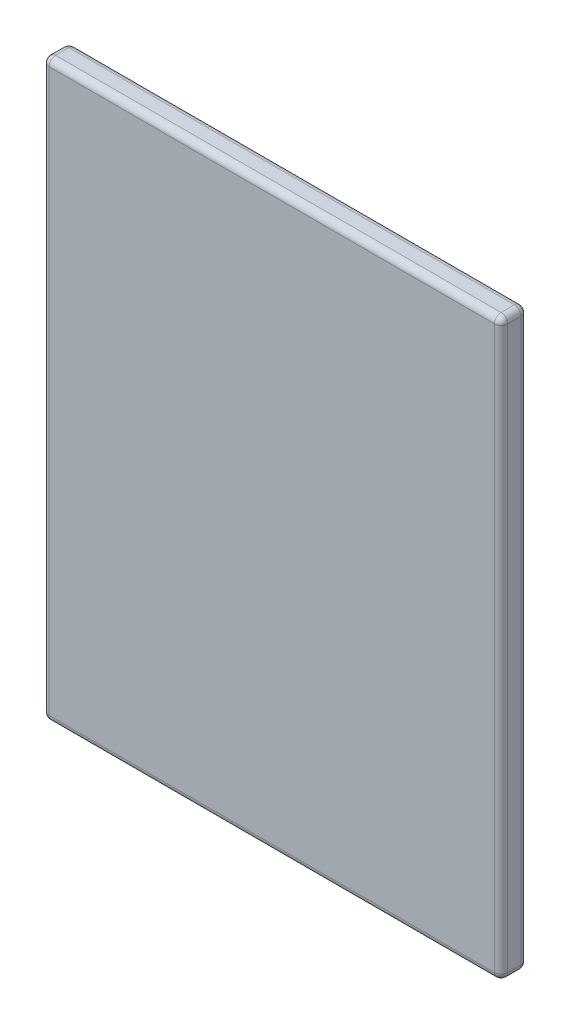
ISO-10303-21;
HEADER;
FILE_DESCRIPTION(('STEP AP214'),'2;1');
FILE_NAME('part.step','',(''),(''),'','','');
FILE_SCHEMA(('AUTOMOTIVE_DESIGN { 1 0 10303 214 1 1 1 1 }'));
ENDSEC;
DATA;
#1=APPLICATION_CONTEXT('core data for automotive mechanical design processes');
#2=APPLICATION_PROTOCOL_DEFINITION('international standard','automotive_design',2000,#1);
#3=PRODUCT_CONTEXT('',#1,'mechanical');
#4=PRODUCT('Part','Part','',(#3));
#5=PRODUCT_RELATED_PRODUCT_CATEGORY('part','',(#4));
#6=PRODUCT_DEFINITION_FORMATION('','',#4);
#7=PRODUCT_DEFINITION_CONTEXT('part definition',#1,'design');
#8=PRODUCT_DEFINITION('design','',#6,#7);
#9=PRODUCT_DEFINITION_SHAPE('','',#8);
#10=(LENGTH_UNIT() NAMED_UNIT(*) SI_UNIT(.MILLI.,.METRE.));
#11=(NAMED_UNIT(*) PLANE_ANGLE_UNIT() SI_UNIT($,.RADIAN.));
#12=(NAMED_UNIT(*) SI_UNIT($,.STERADIAN.) SOLID_ANGLE_UNIT());
#13=UNCERTAINTY_MEASURE_WITH_UNIT(LENGTH_MEASURE(1.E-05),#10,'distance_accuracy_value','');
#14=(GEOMETRIC_REPRESENTATION_CONTEXT(3) GLOBAL_UNCERTAINTY_ASSIGNED_CONTEXT((#13)) GLOBAL_UNIT_ASSIGNED_CONTEXT((#10,
#11,#12)) REPRESENTATION_CONTEXT('',''));
#15=CARTESIAN_POINT('',(0.,0.,0.));
#16=DIRECTION('',(0.,0.,1.));
#17=DIRECTION('',(1.,0.,0.));
#18=AXIS2_PLACEMENT_3D('',#15,#16,#17);
#19=CARTESIAN_POINT('',(17.35,-21.75,2.));
#20=DIRECTION('',(-1.,0.,0.));
#21=DIRECTION('',(0.,0.,1.));
#22=AXIS2_PLACEMENT_3D('',#19,#20,#21);
#23=PLANE('',#22);
#24=DIRECTION('',(0.,1.,0.));
#25=VECTOR('',#24,1.);
#26=CARTESIAN_POINT('',(17.35,-21.75,1.5));
#27=LINE('',#26,#25);
#28=CARTESIAN_POINT('',(17.35,21.25,1.5));
#29=VERTEX_POINT('',#28);
#30=CARTESIAN_POINT('',(17.35,-21.25,1.5));
#31=VERTEX_POINT('',#30);
#32=EDGE_CURVE('E41',#29,#31,#27,.F.);
#33=ORIENTED_EDGE('',*,*,#32,.T.);
#34=DIRECTION('',(0.,0.,-1.));
#35=VECTOR('',#34,1.);
#36=CARTESIAN_POINT('',(17.35,-21.25,2.));
#37=LINE('',#36,#35);
#38=CARTESIAN_POINT('',(17.35,-21.25,0.5));
#39=VERTEX_POINT('',#38);
#40=EDGE_CURVE('E11',#31,#39,#37,.T.);
#41=ORIENTED_EDGE('',*,*,#40,.T.);
#42=DIRECTION('',(0.,1.,0.));
#43=VECTOR('',#42,1.);
#44=CARTESIAN_POINT('',(17.35,21.75,0.5));
#45=LINE('',#44,#43);
#46=CARTESIAN_POINT('',(17.35,21.25,0.5));
#47=VERTEX_POINT('',#46);
#48=EDGE_CURVE('E193',#39,#47,#45,.T.);
#49=ORIENTED_EDGE('',*,*,#48,.T.);
#50=DIRECTION('',(0.,0.,-1.));
#51=VECTOR('',#50,1.);
#52=CARTESIAN_POINT('',(17.35,21.25,2.));
#53=LINE('',#52,#51);
#54=EDGE_CURVE('E52',#47,#29,#53,.F.);
#55=ORIENTED_EDGE('',*,*,#54,.T.);
#56=EDGE_LOOP('',(#33,#41,#49,#55));
#57=FACE_BOUND('',#56,.T.);
#58=ADVANCED_FACE('F32',(#57),#23,.F.);
#59=CARTESIAN_POINT('',(-17.35,21.75,2.));
#60=DIRECTION('',(0.,-1.,0.));
#61=DIRECTION('',(0.,0.,-1.));
#62=AXIS2_PLACEMENT_3D('',#59,#60,#61);
#63=PLANE('',#62);
#64=DIRECTION('',(0.,0.,-1.));
#65=VECTOR('',#64,1.);
#66=CARTESIAN_POINT('',(-16.85,21.75,2.));
#67=LINE('',#66,#65);
#68=CARTESIAN_POINT('',(-16.85,21.75,0.5));
#69=VERTEX_POINT('',#68);
#70=CARTESIAN_POINT('',(-16.85,21.75,1.5));
#71=VERTEX_POINT('',#70);
#72=EDGE_CURVE('E188',#69,#71,#67,.F.);
#73=ORIENTED_EDGE('',*,*,#72,.T.);
#74=DIRECTION('',(-1.,0.,0.));
#75=VECTOR('',#74,1.);
#76=CARTESIAN_POINT('',(-17.35,21.75,1.5));
#77=LINE('',#76,#75);
#78=CARTESIAN_POINT('',(16.85,21.75,1.5));
#79=VERTEX_POINT('',#78);
#80=EDGE_CURVE('E190',#71,#79,#77,.F.);
#81=ORIENTED_EDGE('',*,*,#80,.T.);
#82=DIRECTION('',(0.,0.,-1.));
#83=VECTOR('',#82,1.);
#84=CARTESIAN_POINT('',(16.85,21.75,2.));
#85=LINE('',#84,#83);
#86=CARTESIAN_POINT('',(16.85,21.75,0.5));
#87=VERTEX_POINT('',#86);
#88=EDGE_CURVE('E184',#79,#87,#85,.T.);
#89=ORIENTED_EDGE('',*,*,#88,.T.);
#90=DIRECTION('',(-1.,0.,0.));
#91=VECTOR('',#90,1.);
#92=CARTESIAN_POINT('',(-17.35,21.75,0.5));
#93=LINE('',#92,#91);
#94=EDGE_CURVE('E186',#87,#69,#93,.T.);
#95=ORIENTED_EDGE('',*,*,#94,.T.);
#96=EDGE_LOOP('',(#73,#81,#89,#95));
#97=FACE_BOUND('',#96,.T.);
#98=ADVANCED_FACE('F277',(#97),#63,.F.);
#99=CARTESIAN_POINT('',(-17.35,-21.75,2.));
#100=DIRECTION('',(1.,0.,0.));
#101=DIRECTION('',(0.,0.,-1.));
#102=AXIS2_PLACEMENT_3D('',#99,#100,#101);
#103=PLANE('',#102);
#104=DIRECTION('',(0.,0.,-1.));
#105=VECTOR('',#104,1.);
#106=CARTESIAN_POINT('',(-17.35,-21.25,2.));
#107=LINE('',#106,#105);
#108=CARTESIAN_POINT('',(-17.35,-21.25,0.5));
#109=VERTEX_POINT('',#108);
#110=CARTESIAN_POINT('',(-17.35,-21.25,1.5));
#111=VERTEX_POINT('',#110);
#112=EDGE_CURVE('E179',#109,#111,#107,.F.);
#113=ORIENTED_EDGE('',*,*,#112,.T.);
#114=DIRECTION('',(0.,-1.,0.));
#115=VECTOR('',#114,1.);
#116=CARTESIAN_POINT('',(-17.35,-21.75,1.5));
#117=LINE('',#116,#115);
#118=CARTESIAN_POINT('',(-17.35,21.25,1.5));
#119=VERTEX_POINT('',#118);
#120=EDGE_CURVE('E181',#111,#119,#117,.F.);
#121=ORIENTED_EDGE('',*,*,#120,.T.);
#122=DIRECTION('',(0.,0.,-1.));
#123=VECTOR('',#122,1.);
#124=CARTESIAN_POINT('',(-17.35,21.25,2.));
#125=LINE('',#124,#123);
#126=CARTESIAN_POINT('',(-17.35,21.25,0.5));
#127=VERTEX_POINT('',#126);
#128=EDGE_CURVE('E175',#119,#127,#125,.T.);
#129=ORIENTED_EDGE('',*,*,#128,.T.);
#130=DIRECTION('',(0.,-1.,0.));
#131=VECTOR('',#130,1.);
#132=CARTESIAN_POINT('',(-17.35,-21.75,0.5));
#133=LINE('',#132,#131);
#134=EDGE_CURVE('E177',#127,#109,#133,.T.);
#135=ORIENTED_EDGE('',*,*,#134,.T.);
#136=EDGE_LOOP('',(#113,#121,#129,#135));
#137=FACE_BOUND('',#136,.T.);
#138=ADVANCED_FACE('F268',(#137),#103,.F.);
#139=CARTESIAN_POINT('',(-17.35,-21.75,2.));
#140=DIRECTION('',(0.,1.,0.));
#141=DIRECTION('',(0.,0.,1.));
#142=AXIS2_PLACEMENT_3D('',#139,#140,#141);
#143=PLANE('',#142);
#144=DIRECTION('',(1.,0.,0.));
#145=VECTOR('',#144,1.);
#146=CARTESIAN_POINT('',(-17.35,-21.75,1.5));
#147=LINE('',#146,#145);
#148=CARTESIAN_POINT('',(16.85,-21.75,1.5));
#149=VERTEX_POINT('',#148);
#150=CARTESIAN_POINT('',(-16.85,-21.75,1.5));
#151=VERTEX_POINT('',#150);
#152=EDGE_CURVE('E128',#149,#151,#147,.F.);
#153=ORIENTED_EDGE('',*,*,#152,.T.);
#154=DIRECTION('',(0.,0.,-1.));
#155=VECTOR('',#154,1.);
#156=CARTESIAN_POINT('',(-16.85,-21.75,2.));
#157=LINE('',#156,#155);
#158=CARTESIAN_POINT('',(-16.85,-21.75,0.5));
#159=VERTEX_POINT('',#158);
#160=EDGE_CURVE('E164',#151,#159,#157,.T.);
#161=ORIENTED_EDGE('',*,*,#160,.T.);
#162=DIRECTION('',(1.,0.,0.));
#163=VECTOR('',#162,1.);
#164=CARTESIAN_POINT('',(17.35,-21.75,0.5));
#165=LINE('',#164,#163);
#166=CARTESIAN_POINT('',(16.85,-21.75,0.5));
#167=VERTEX_POINT('',#166);
#168=EDGE_CURVE('E157',#159,#167,#165,.T.);
#169=ORIENTED_EDGE('',*,*,#168,.T.);
#170=DIRECTION('',(0.,0.,-1.));
#171=VECTOR('',#170,1.);
#172=CARTESIAN_POINT('',(16.85,-21.75,2.));
#173=LINE('',#172,#171);
#174=EDGE_CURVE('E155',#167,#149,#173,.F.);
#175=ORIENTED_EDGE('',*,*,#174,.T.);
#176=EDGE_LOOP('',(#153,#161,#169,#175));
#177=FACE_BOUND('',#176,.T.);
#178=ADVANCED_FACE('F355',(#177),#143,.F.);
#179=CARTESIAN_POINT('',(0.,0.,2.));
#180=DIRECTION('',(0.,0.,-1.));
#181=DIRECTION('',(-1.,0.,0.));
#182=AXIS2_PLACEMENT_3D('',#179,#180,#181);
#183=PLANE('',#182);
#184=DIRECTION('',(0.,-1.,0.));
#185=VECTOR('',#184,1.);
#186=CARTESIAN_POINT('',(-16.85,0.,2.));
#187=LINE('',#186,#185);
#188=CARTESIAN_POINT('',(-16.85,21.25,2.));
#189=VERTEX_POINT('',#188);
#190=CARTESIAN_POINT('',(-16.85,-21.25,2.));
#191=VERTEX_POINT('',#190);
#192=EDGE_CURVE('E153',#189,#191,#187,.T.);
#193=ORIENTED_EDGE('',*,*,#192,.T.);
#194=DIRECTION('',(1.,0.,0.));
#195=VECTOR('',#194,1.);
#196=CARTESIAN_POINT('',(0.,-21.25,2.));
#197=LINE('',#196,#195);
#198=CARTESIAN_POINT('',(16.85,-21.25,2.));
#199=VERTEX_POINT('',#198);
#200=EDGE_CURVE('E126',#191,#199,#197,.T.);
#201=ORIENTED_EDGE('',*,*,#200,.T.);
#202=DIRECTION('',(0.,1.,0.));
#203=VECTOR('',#202,1.);
#204=CARTESIAN_POINT('',(16.85,0.,2.));
#205=LINE('',#204,#203);
#206=CARTESIAN_POINT('',(16.85,21.25,2.));
#207=VERTEX_POINT('',#206);
#208=EDGE_CURVE('E143',#199,#207,#205,.T.);
#209=ORIENTED_EDGE('',*,*,#208,.T.);
#210=DIRECTION('',(-1.,0.,0.));
#211=VECTOR('',#210,1.);
#212=CARTESIAN_POINT('',(0.,21.25,2.));
#213=LINE('',#212,#211);
#214=EDGE_CURVE('E149',#207,#189,#213,.T.);
#215=ORIENTED_EDGE('',*,*,#214,.T.);
#216=EDGE_LOOP('',(#193,#201,#209,#215));
#217=FACE_BOUND('',#216,.T.);
#218=ADVANCED_FACE('F151',(#217),#183,.F.);
#219=CARTESIAN_POINT('',(0.,0.,0.));
#220=DIRECTION('',(0.,0.,-1.));
#221=DIRECTION('',(-1.,0.,0.));
#222=AXIS2_PLACEMENT_3D('',#219,#220,#221);
#223=PLANE('',#222);
#224=DIRECTION('',(0.,1.,0.));
#225=VECTOR('',#224,1.);
#226=CARTESIAN_POINT('',(16.85,-21.75,0.));
#227=LINE('',#226,#225);
#228=CARTESIAN_POINT('',(16.85,21.25,0.));
#229=VERTEX_POINT('',#228);
#230=CARTESIAN_POINT('',(16.85,-21.25,0.));
#231=VERTEX_POINT('',#230);
#232=EDGE_CURVE('E166',#229,#231,#227,.F.);
#233=ORIENTED_EDGE('',*,*,#232,.T.);
#234=DIRECTION('',(1.,0.,0.));
#235=VECTOR('',#234,1.);
#236=CARTESIAN_POINT('',(-17.35,-21.25,0.));
#237=LINE('',#236,#235);
#238=CARTESIAN_POINT('',(-16.85,-21.25,0.));
#239=VERTEX_POINT('',#238);
#240=EDGE_CURVE('E172',#231,#239,#237,.F.);
#241=ORIENTED_EDGE('',*,*,#240,.T.);
#242=DIRECTION('',(0.,-1.,0.));
#243=VECTOR('',#242,1.);
#244=CARTESIAN_POINT('',(-16.85,21.75,0.));
#245=LINE('',#244,#243);
#246=CARTESIAN_POINT('',(-16.85,21.25,0.));
#247=VERTEX_POINT('',#246);
#248=EDGE_CURVE('E170',#239,#247,#245,.F.);
#249=ORIENTED_EDGE('',*,*,#248,.T.);
#250=DIRECTION('',(-1.,0.,0.));
#251=VECTOR('',#250,1.);
#252=CARTESIAN_POINT('',(17.35,21.25,0.));
#253=LINE('',#252,#251);
#254=EDGE_CURVE('E168',#247,#229,#253,.F.);
#255=ORIENTED_EDGE('',*,*,#254,.T.);
#256=EDGE_LOOP('',(#233,#241,#249,#255));
#257=FACE_BOUND('',#256,.T.);
#258=ADVANCED_FACE('F295',(#257),#223,.T.);
#259=CARTESIAN_POINT('',(-17.35,21.25,0.5));
#260=DIRECTION('',(1.,0.,0.));
#261=DIRECTION('',(0.,0.,-1.));
#262=AXIS2_PLACEMENT_3D('',#259,#260,#261);
#263=CYLINDRICAL_SURFACE('',#262,0.5);
#264=CARTESIAN_POINT('',(-16.85,21.25,0.5));
#265=DIRECTION('',(-1.,0.,0.));
#266=DIRECTION('',(0.,0.,1.));
#267=AXIS2_PLACEMENT_3D('',#264,#265,#266);
#268=CIRCLE('',#267,0.5);
#269=EDGE_CURVE('E36',#69,#247,#268,.T.);
#270=ORIENTED_EDGE('',*,*,#269,.F.);
#271=ORIENTED_EDGE('',*,*,#94,.F.);
#272=CARTESIAN_POINT('',(16.85,21.25,0.5));
#273=DIRECTION('',(1.,0.,0.));
#274=DIRECTION('',(0.,0.,-1.));
#275=AXIS2_PLACEMENT_3D('',#272,#273,#274);
#276=CIRCLE('',#275,0.5);
#277=EDGE_CURVE('E245',#229,#87,#276,.T.);
#278=ORIENTED_EDGE('',*,*,#277,.F.);
#279=ORIENTED_EDGE('',*,*,#254,.F.);
#280=EDGE_LOOP('',(#270,#271,#278,#279));
#281=FACE_BOUND('',#280,.T.);
#282=ADVANCED_FACE('F34',(#281),#263,.T.);
#283=CARTESIAN_POINT('',(-16.85,21.25,0.5));
#284=DIRECTION('',(0.,0.,1.));
#285=DIRECTION('',(1.,0.,0.));
#286=AXIS2_PLACEMENT_3D('',#283,#284,#285);
#287=SPHERICAL_SURFACE('',#286,0.5);
#288=CARTESIAN_POINT('',(-16.85,21.25,0.5));
#289=DIRECTION('',(0.,0.,-1.));
#290=DIRECTION('',(-1.,0.,0.));
#291=AXIS2_PLACEMENT_3D('',#288,#289,#290);
#292=CIRCLE('',#291,0.5);
#293=EDGE_CURVE('E240',#69,#127,#292,.F.);
#294=ORIENTED_EDGE('',*,*,#293,.F.);
#295=ORIENTED_EDGE('',*,*,#269,.T.);
#296=CARTESIAN_POINT('',(-16.85,21.25,0.5));
#297=DIRECTION('',(0.,1.,0.));
#298=DIRECTION('',(0.,0.,1.));
#299=AXIS2_PLACEMENT_3D('',#296,#297,#298);
#300=CIRCLE('',#299,0.5);
#301=EDGE_CURVE('E243',#127,#247,#300,.F.);
#302=ORIENTED_EDGE('',*,*,#301,.F.);
#303=EDGE_LOOP('',(#294,#295,#302));
#304=FACE_BOUND('',#303,.T.);
#305=ADVANCED_FACE('F256',(#304),#287,.T.);
#306=CARTESIAN_POINT('',(16.85,21.25,0.5));
#307=DIRECTION('',(0.,0.,1.));
#308=DIRECTION('',(1.,0.,0.));
#309=AXIS2_PLACEMENT_3D('',#306,#307,#308);
#310=SPHERICAL_SURFACE('',#309,0.5);
#311=CARTESIAN_POINT('',(16.85,21.25,0.5));
#312=DIRECTION('',(0.,1.,0.));
#313=DIRECTION('',(0.,0.,1.));
#314=AXIS2_PLACEMENT_3D('',#311,#312,#313);
#315=CIRCLE('',#314,0.5);
#316=EDGE_CURVE('E234',#229,#47,#315,.F.);
#317=ORIENTED_EDGE('',*,*,#316,.F.);
#318=ORIENTED_EDGE('',*,*,#277,.T.);
#319=CARTESIAN_POINT('',(16.85,21.25,0.5));
#320=DIRECTION('',(0.,0.,-1.));
#321=DIRECTION('',(-1.,0.,0.));
#322=AXIS2_PLACEMENT_3D('',#319,#320,#321);
#323=CIRCLE('',#322,0.5);
#324=EDGE_CURVE('E237',#47,#87,#323,.F.);
#325=ORIENTED_EDGE('',*,*,#324,.F.);
#326=EDGE_LOOP('',(#317,#318,#325));
#327=FACE_BOUND('',#326,.T.);
#328=ADVANCED_FACE('F288',(#327),#310,.T.);
#329=CARTESIAN_POINT('',(-16.85,-21.75,0.5));
#330=DIRECTION('',(0.,1.,0.));
#331=DIRECTION('',(0.,0.,1.));
#332=AXIS2_PLACEMENT_3D('',#329,#330,#331);
#333=CYLINDRICAL_SURFACE('',#332,0.5);
#334=ORIENTED_EDGE('',*,*,#301,.T.);
#335=ORIENTED_EDGE('',*,*,#248,.F.);
#336=CARTESIAN_POINT('',(-16.85,-21.25,0.5));
#337=DIRECTION('',(0.,-1.,0.));
#338=DIRECTION('',(0.,0.,-1.));
#339=AXIS2_PLACEMENT_3D('',#336,#337,#338);
#340=CIRCLE('',#339,0.5);
#341=EDGE_CURVE('E229',#109,#239,#340,.T.);
#342=ORIENTED_EDGE('',*,*,#341,.F.);
#343=ORIENTED_EDGE('',*,*,#134,.F.);
#344=EDGE_LOOP('',(#334,#335,#342,#343));
#345=FACE_BOUND('',#344,.T.);
#346=ADVANCED_FACE('F264',(#345),#333,.T.);
#347=CARTESIAN_POINT('',(-16.85,21.25,2.));
#348=DIRECTION('',(0.,0.,-1.));
#349=DIRECTION('',(-1.,0.,0.));
#350=AXIS2_PLACEMENT_3D('',#347,#348,#349);
#351=CYLINDRICAL_SURFACE('',#350,0.5);
#352=ORIENTED_EDGE('',*,*,#293,.T.);
#353=ORIENTED_EDGE('',*,*,#128,.F.);
#354=CARTESIAN_POINT('',(-16.85,21.25,1.5));
#355=DIRECTION('',(0.,0.,1.));
#356=DIRECTION('',(1.,0.,0.));
#357=AXIS2_PLACEMENT_3D('',#354,#355,#356);
#358=CIRCLE('',#357,0.5);
#359=EDGE_CURVE('E226',#71,#119,#358,.T.);
#360=ORIENTED_EDGE('',*,*,#359,.F.);
#361=ORIENTED_EDGE('',*,*,#72,.F.);
#362=EDGE_LOOP('',(#352,#353,#360,#361));
#363=FACE_BOUND('',#362,.T.);
#364=ADVANCED_FACE('F274',(#363),#351,.T.);
#365=CARTESIAN_POINT('',(0.,21.25,1.5));
#366=DIRECTION('',(-1.,0.,0.));
#367=DIRECTION('',(0.,0.,1.));
#368=AXIS2_PLACEMENT_3D('',#365,#366,#367);
#369=CYLINDRICAL_SURFACE('',#368,0.5);
#370=CARTESIAN_POINT('',(16.85,21.25,1.5));
#371=DIRECTION('',(1.,0.,0.));
#372=DIRECTION('',(0.,0.,-1.));
#373=AXIS2_PLACEMENT_3D('',#370,#371,#372);
#374=CIRCLE('',#373,0.5);
#375=EDGE_CURVE('E220',#79,#207,#374,.T.);
#376=ORIENTED_EDGE('',*,*,#375,.F.);
#377=ORIENTED_EDGE('',*,*,#80,.F.);
#378=CARTESIAN_POINT('',(-16.85,21.25,1.5));
#379=DIRECTION('',(-1.,0.,0.));
#380=DIRECTION('',(0.,0.,1.));
#381=AXIS2_PLACEMENT_3D('',#378,#379,#380);
#382=CIRCLE('',#381,0.5);
#383=EDGE_CURVE('E223',#189,#71,#382,.T.);
#384=ORIENTED_EDGE('',*,*,#383,.F.);
#385=ORIENTED_EDGE('',*,*,#214,.F.);
#386=EDGE_LOOP('',(#376,#377,#384,#385));
#387=FACE_BOUND('',#386,.T.);
#388=ADVANCED_FACE('F281',(#387),#369,.T.);
#389=CARTESIAN_POINT('',(16.85,21.25,2.));
#390=DIRECTION('',(0.,0.,-1.));
#391=DIRECTION('',(-1.,0.,0.));
#392=AXIS2_PLACEMENT_3D('',#389,#390,#391);
#393=CYLINDRICAL_SURFACE('',#392,0.5);
#394=ORIENTED_EDGE('',*,*,#324,.T.);
#395=ORIENTED_EDGE('',*,*,#88,.F.);
#396=CARTESIAN_POINT('',(16.85,21.25,1.5));
#397=DIRECTION('',(0.,0.,1.));
#398=DIRECTION('',(1.,0.,0.));
#399=AXIS2_PLACEMENT_3D('',#396,#397,#398);
#400=CIRCLE('',#399,0.5);
#401=EDGE_CURVE('E218',#29,#79,#400,.T.);
#402=ORIENTED_EDGE('',*,*,#401,.F.);
#403=ORIENTED_EDGE('',*,*,#54,.F.);
#404=EDGE_LOOP('',(#394,#395,#402,#403));
#405=FACE_BOUND('',#404,.T.);
#406=ADVANCED_FACE('F286',(#405),#393,.T.);
#407=CARTESIAN_POINT('',(16.85,-21.75,0.5));
#408=DIRECTION('',(0.,-1.,0.));
#409=DIRECTION('',(0.,0.,-1.));
#410=AXIS2_PLACEMENT_3D('',#407,#408,#409);
#411=CYLINDRICAL_SURFACE('',#410,0.5);
#412=ORIENTED_EDGE('',*,*,#316,.T.);
#413=ORIENTED_EDGE('',*,*,#48,.F.);
#414=CARTESIAN_POINT('',(16.85,-21.25,0.5));
#415=DIRECTION('',(0.,-1.,0.));
#416=DIRECTION('',(0.,0.,-1.));
#417=AXIS2_PLACEMENT_3D('',#414,#415,#416);
#418=CIRCLE('',#417,0.5);
#419=EDGE_CURVE('E215',#231,#39,#418,.T.);
#420=ORIENTED_EDGE('',*,*,#419,.F.);
#421=ORIENTED_EDGE('',*,*,#232,.F.);
#422=EDGE_LOOP('',(#412,#413,#420,#421));
#423=FACE_BOUND('',#422,.T.);
#424=ADVANCED_FACE('F292',(#423),#411,.T.);
#425=CARTESIAN_POINT('',(-17.35,-21.25,0.5));
#426=DIRECTION('',(-1.,0.,0.));
#427=DIRECTION('',(0.,0.,1.));
#428=AXIS2_PLACEMENT_3D('',#425,#426,#427);
#429=CYLINDRICAL_SURFACE('',#428,0.5);
#430=CARTESIAN_POINT('',(-16.85,-21.25,0.5));
#431=DIRECTION('',(-1.,0.,0.));
#432=DIRECTION('',(0.,0.,1.));
#433=AXIS2_PLACEMENT_3D('',#430,#431,#432);
#434=CIRCLE('',#433,0.5);
#435=EDGE_CURVE('E231',#239,#159,#434,.T.);
#436=ORIENTED_EDGE('',*,*,#435,.F.);
#437=ORIENTED_EDGE('',*,*,#240,.F.);
#438=CARTESIAN_POINT('',(16.85,-21.25,0.5));
#439=DIRECTION('',(1.,0.,0.));
#440=DIRECTION('',(0.,0.,-1.));
#441=AXIS2_PLACEMENT_3D('',#438,#439,#440);
#442=CIRCLE('',#441,0.5);
#443=EDGE_CURVE('E212',#167,#231,#442,.T.);
#444=ORIENTED_EDGE('',*,*,#443,.F.);
#445=ORIENTED_EDGE('',*,*,#168,.F.);
#446=EDGE_LOOP('',(#436,#437,#444,#445));
#447=FACE_BOUND('',#446,.T.);
#448=ADVANCED_FACE('F299',(#447),#429,.T.);
#449=CARTESIAN_POINT('',(-16.85,-21.25,0.5));
#450=DIRECTION('',(0.,0.,1.));
#451=DIRECTION('',(1.,0.,0.));
#452=AXIS2_PLACEMENT_3D('',#449,#450,#451);
#453=SPHERICAL_SURFACE('',#452,0.5);
#454=ORIENTED_EDGE('',*,*,#341,.T.);
#455=ORIENTED_EDGE('',*,*,#435,.T.);
#456=CARTESIAN_POINT('',(-16.85,-21.25,0.5));
#457=DIRECTION('',(0.,0.,-1.));
#458=DIRECTION('',(-1.,0.,0.));
#459=AXIS2_PLACEMENT_3D('',#456,#457,#458);
#460=CIRCLE('',#459,0.5);
#461=EDGE_CURVE('E209',#109,#159,#460,.F.);
#462=ORIENTED_EDGE('',*,*,#461,.F.);
#463=EDGE_LOOP('',(#454,#455,#462));
#464=FACE_BOUND('',#463,.T.);
#465=ADVANCED_FACE('F303',(#464),#453,.T.);
#466=CARTESIAN_POINT('',(-16.85,21.25,1.5));
#467=DIRECTION('',(0.,0.,1.));
#468=DIRECTION('',(1.,0.,0.));
#469=AXIS2_PLACEMENT_3D('',#466,#467,#468);
#470=SPHERICAL_SURFACE('',#469,0.5);
#471=ORIENTED_EDGE('',*,*,#383,.T.);
#472=ORIENTED_EDGE('',*,*,#359,.T.);
#473=CARTESIAN_POINT('',(-16.85,21.25,1.5));
#474=DIRECTION('',(0.,1.,0.));
#475=DIRECTION('',(0.,0.,1.));
#476=AXIS2_PLACEMENT_3D('',#473,#474,#475);
#477=CIRCLE('',#476,0.5);
#478=EDGE_CURVE('E207',#189,#119,#477,.F.);
#479=ORIENTED_EDGE('',*,*,#478,.F.);
#480=EDGE_LOOP('',(#471,#472,#479));
#481=FACE_BOUND('',#480,.T.);
#482=ADVANCED_FACE('F314',(#481),#470,.T.);
#483=CARTESIAN_POINT('',(16.85,21.25,1.5));
#484=DIRECTION('',(0.,0.,1.));
#485=DIRECTION('',(1.,0.,0.));
#486=AXIS2_PLACEMENT_3D('',#483,#484,#485);
#487=SPHERICAL_SURFACE('',#486,0.5);
#488=ORIENTED_EDGE('',*,*,#401,.T.);
#489=ORIENTED_EDGE('',*,*,#375,.T.);
#490=CARTESIAN_POINT('',(16.85,21.25,1.5));
#491=DIRECTION('',(0.,1.,0.));
#492=DIRECTION('',(0.,0.,1.));
#493=AXIS2_PLACEMENT_3D('',#490,#491,#492);
#494=CIRCLE('',#493,0.5);
#495=EDGE_CURVE('E146',#29,#207,#494,.F.);
#496=ORIENTED_EDGE('',*,*,#495,.F.);
#497=EDGE_LOOP('',(#488,#489,#496));
#498=FACE_BOUND('',#497,.T.);
#499=ADVANCED_FACE('F316',(#498),#487,.T.);
#500=CARTESIAN_POINT('',(16.85,-21.25,0.5));
#501=DIRECTION('',(0.,0.,1.));
#502=DIRECTION('',(1.,0.,0.));
#503=AXIS2_PLACEMENT_3D('',#500,#501,#502);
#504=SPHERICAL_SURFACE('',#503,0.5);
#505=ORIENTED_EDGE('',*,*,#443,.T.);
#506=ORIENTED_EDGE('',*,*,#419,.T.);
#507=CARTESIAN_POINT('',(16.85,-21.25,0.5));
#508=DIRECTION('',(0.,0.,-1.));
#509=DIRECTION('',(-1.,0.,0.));
#510=AXIS2_PLACEMENT_3D('',#507,#508,#509);
#511=CIRCLE('',#510,0.5);
#512=EDGE_CURVE('E204',#167,#39,#511,.F.);
#513=ORIENTED_EDGE('',*,*,#512,.F.);
#514=EDGE_LOOP('',(#505,#506,#513));
#515=FACE_BOUND('',#514,.T.);
#516=ADVANCED_FACE('F322',(#515),#504,.T.);
#517=CARTESIAN_POINT('',(-16.85,-21.25,2.));
#518=DIRECTION('',(0.,0.,-1.));
#519=DIRECTION('',(-1.,0.,0.));
#520=AXIS2_PLACEMENT_3D('',#517,#518,#519);
#521=CYLINDRICAL_SURFACE('',#520,0.5);
#522=ORIENTED_EDGE('',*,*,#461,.T.);
#523=ORIENTED_EDGE('',*,*,#160,.F.);
#524=CARTESIAN_POINT('',(-16.85,-21.25,1.5));
#525=DIRECTION('',(0.,0.,1.));
#526=DIRECTION('',(1.,0.,0.));
#527=AXIS2_PLACEMENT_3D('',#524,#525,#526);
#528=CIRCLE('',#527,0.5);
#529=EDGE_CURVE('E201',#111,#151,#528,.T.);
#530=ORIENTED_EDGE('',*,*,#529,.F.);
#531=ORIENTED_EDGE('',*,*,#112,.F.);
#532=EDGE_LOOP('',(#522,#523,#530,#531));
#533=FACE_BOUND('',#532,.T.);
#534=ADVANCED_FACE('F306',(#533),#521,.T.);
#535=CARTESIAN_POINT('',(-16.85,0.,1.5));
#536=DIRECTION('',(0.,-1.,0.));
#537=DIRECTION('',(0.,0.,-1.));
#538=AXIS2_PLACEMENT_3D('',#535,#536,#537);
#539=CYLINDRICAL_SURFACE('',#538,0.5);
#540=ORIENTED_EDGE('',*,*,#478,.T.);
#541=ORIENTED_EDGE('',*,*,#120,.F.);
#542=CARTESIAN_POINT('',(-16.85,-21.25,1.5));
#543=DIRECTION('',(0.,-1.,0.));
#544=DIRECTION('',(0.,0.,-1.));
#545=AXIS2_PLACEMENT_3D('',#542,#543,#544);
#546=CIRCLE('',#545,0.5);
#547=EDGE_CURVE('E140',#191,#111,#546,.T.);
#548=ORIENTED_EDGE('',*,*,#547,.F.);
#549=ORIENTED_EDGE('',*,*,#192,.F.);
#550=EDGE_LOOP('',(#540,#541,#548,#549));
#551=FACE_BOUND('',#550,.T.);
#552=ADVANCED_FACE('F312',(#551),#539,.T.);
#553=CARTESIAN_POINT('',(16.85,0.,1.5));
#554=DIRECTION('',(0.,1.,0.));
#555=DIRECTION('',(0.,0.,1.));
#556=AXIS2_PLACEMENT_3D('',#553,#554,#555);
#557=CYLINDRICAL_SURFACE('',#556,0.5);
#558=ORIENTED_EDGE('',*,*,#495,.T.);
#559=ORIENTED_EDGE('',*,*,#208,.F.);
#560=CARTESIAN_POINT('',(16.85,-21.25,1.5));
#561=DIRECTION('',(0.,-1.,0.));
#562=DIRECTION('',(0.,0.,-1.));
#563=AXIS2_PLACEMENT_3D('',#560,#561,#562);
#564=CIRCLE('',#563,0.5);
#565=EDGE_CURVE('E134',#31,#199,#564,.T.);
#566=ORIENTED_EDGE('',*,*,#565,.F.);
#567=ORIENTED_EDGE('',*,*,#32,.F.);
#568=EDGE_LOOP('',(#558,#559,#566,#567));
#569=FACE_BOUND('',#568,.T.);
#570=ADVANCED_FACE('F144',(#569),#557,.T.);
#571=CARTESIAN_POINT('',(16.85,-21.25,2.));
#572=DIRECTION('',(0.,0.,-1.));
#573=DIRECTION('',(-1.,0.,0.));
#574=AXIS2_PLACEMENT_3D('',#571,#572,#573);
#575=CYLINDRICAL_SURFACE('',#574,0.5);
#576=ORIENTED_EDGE('',*,*,#512,.T.);
#577=ORIENTED_EDGE('',*,*,#40,.F.);
#578=CARTESIAN_POINT('',(16.85,-21.25,1.5));
#579=DIRECTION('',(0.,0.,1.));
#580=DIRECTION('',(1.,0.,0.));
#581=AXIS2_PLACEMENT_3D('',#578,#579,#580);
#582=CIRCLE('',#581,0.5);
#583=EDGE_CURVE('E138',#149,#31,#582,.T.);
#584=ORIENTED_EDGE('',*,*,#583,.F.);
#585=ORIENTED_EDGE('',*,*,#174,.F.);
#586=EDGE_LOOP('',(#576,#577,#584,#585));
#587=FACE_BOUND('',#586,.T.);
#588=ADVANCED_FACE('F339',(#587),#575,.T.);
#589=CARTESIAN_POINT('',(-16.85,-21.25,1.5));
#590=DIRECTION('',(0.,0.,1.));
#591=DIRECTION('',(1.,0.,0.));
#592=AXIS2_PLACEMENT_3D('',#589,#590,#591);
#593=SPHERICAL_SURFACE('',#592,0.5);
#594=ORIENTED_EDGE('',*,*,#547,.T.);
#595=ORIENTED_EDGE('',*,*,#529,.T.);
#596=CARTESIAN_POINT('',(-16.85,-21.25,1.5));
#597=DIRECTION('',(-1.,0.,0.));
#598=DIRECTION('',(0.,0.,1.));
#599=AXIS2_PLACEMENT_3D('',#596,#597,#598);
#600=CIRCLE('',#599,0.5);
#601=EDGE_CURVE('E131',#191,#151,#600,.F.);
#602=ORIENTED_EDGE('',*,*,#601,.F.);
#603=EDGE_LOOP('',(#594,#595,#602));
#604=FACE_BOUND('',#603,.T.);
#605=ADVANCED_FACE('F310',(#604),#593,.T.);
#606=CARTESIAN_POINT('',(16.85,-21.25,1.5));
#607=DIRECTION('',(0.,0.,1.));
#608=DIRECTION('',(1.,0.,0.));
#609=AXIS2_PLACEMENT_3D('',#606,#607,#608);
#610=SPHERICAL_SURFACE('',#609,0.5);
#611=ORIENTED_EDGE('',*,*,#583,.T.);
#612=ORIENTED_EDGE('',*,*,#565,.T.);
#613=CARTESIAN_POINT('',(16.85,-21.25,1.5));
#614=DIRECTION('',(1.,0.,0.));
#615=DIRECTION('',(0.,0.,-1.));
#616=AXIS2_PLACEMENT_3D('',#613,#614,#615);
#617=CIRCLE('',#616,0.5);
#618=EDGE_CURVE('E122',#149,#199,#617,.F.);
#619=ORIENTED_EDGE('',*,*,#618,.F.);
#620=EDGE_LOOP('',(#611,#612,#619));
#621=FACE_BOUND('',#620,.T.);
#622=ADVANCED_FACE('F136',(#621),#610,.T.);
#623=CARTESIAN_POINT('',(0.,-21.25,1.5));
#624=DIRECTION('',(1.,0.,0.));
#625=DIRECTION('',(0.,0.,-1.));
#626=AXIS2_PLACEMENT_3D('',#623,#624,#625);
#627=CYLINDRICAL_SURFACE('',#626,0.5);
#628=ORIENTED_EDGE('',*,*,#601,.T.);
#629=ORIENTED_EDGE('',*,*,#152,.F.);
#630=ORIENTED_EDGE('',*,*,#618,.T.);
#631=ORIENTED_EDGE('',*,*,#200,.F.);
#632=EDGE_LOOP('',(#628,#629,#630,#631));
#633=FACE_BOUND('',#632,.T.);
#634=ADVANCED_FACE('F124',(#633),#627,.T.);
#635=CLOSED_SHELL('',(#58,#98,#138,#178,#218,#258,#282,#305,#328,#346,#364,#388,#406,#424,#448,
#465,#482,#499,#516,#534,#552,#570,#588,#605,#622,#634));
#636=MANIFOLD_SOLID_BREP('B2',#635);
#637=ADVANCED_BREP_SHAPE_REPRESENTATION('',(#18,#636),#14);
#638=SHAPE_DEFINITION_REPRESENTATION(#9,#637);
ENDSEC;
END-ISO-10303-21;
